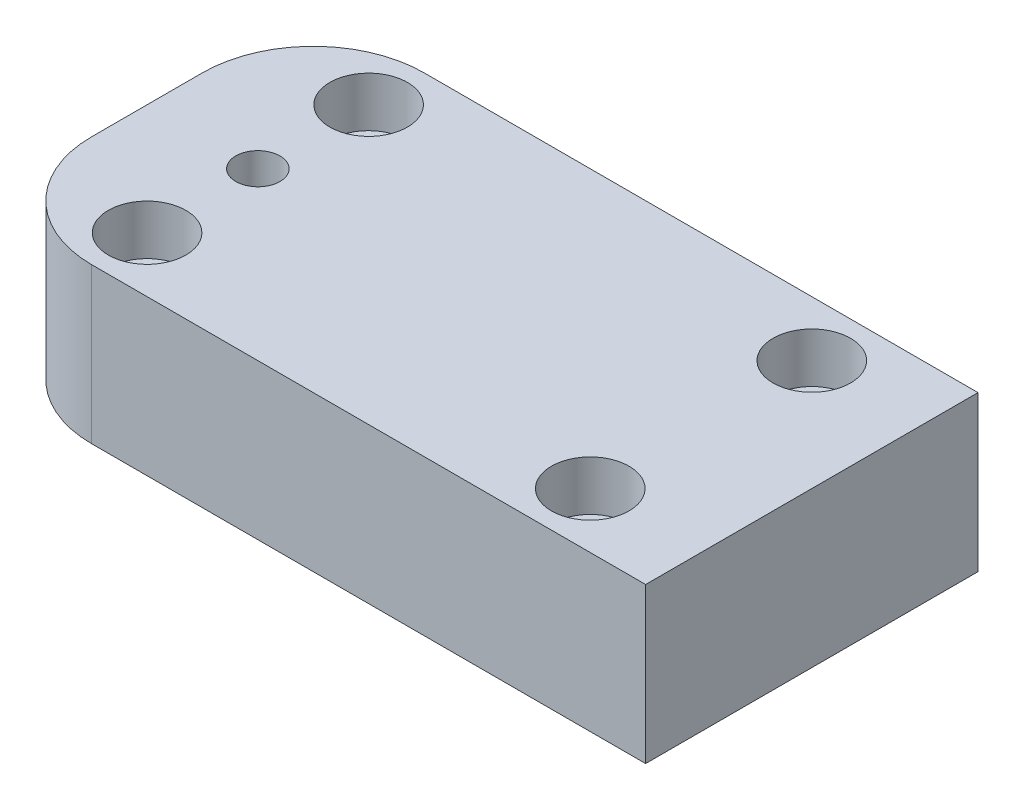
ISO-10303-21;
HEADER;
FILE_DESCRIPTION(('STEP AP214'),'2;1');
FILE_NAME('part.step','',(''),(''),'','','');
FILE_SCHEMA(('AUTOMOTIVE_DESIGN { 1 0 10303 214 1 1 1 1 }'));
ENDSEC;
DATA;
#1=APPLICATION_CONTEXT('core data for automotive mechanical design processes');
#2=APPLICATION_PROTOCOL_DEFINITION('international standard','automotive_design',2000,#1);
#3=PRODUCT_CONTEXT('',#1,'mechanical');
#4=PRODUCT('Part','Part','',(#3));
#5=PRODUCT_RELATED_PRODUCT_CATEGORY('part','',(#4));
#6=PRODUCT_DEFINITION_FORMATION('','',#4);
#7=PRODUCT_DEFINITION_CONTEXT('part definition',#1,'design');
#8=PRODUCT_DEFINITION('design','',#6,#7);
#9=PRODUCT_DEFINITION_SHAPE('','',#8);
#10=(LENGTH_UNIT() NAMED_UNIT(*) SI_UNIT(.MILLI.,.METRE.));
#11=(NAMED_UNIT(*) PLANE_ANGLE_UNIT() SI_UNIT($,.RADIAN.));
#12=(NAMED_UNIT(*) SI_UNIT($,.STERADIAN.) SOLID_ANGLE_UNIT());
#13=UNCERTAINTY_MEASURE_WITH_UNIT(LENGTH_MEASURE(1.E-05),#10,'distance_accuracy_value','');
#14=(GEOMETRIC_REPRESENTATION_CONTEXT(3) GLOBAL_UNCERTAINTY_ASSIGNED_CONTEXT((#13)) GLOBAL_UNIT_ASSIGNED_CONTEXT((#10,
#11,#12)) REPRESENTATION_CONTEXT('',''));
#15=CARTESIAN_POINT('',(0.,0.,0.));
#16=DIRECTION('',(0.,0.,1.));
#17=DIRECTION('',(1.,0.,0.));
#18=AXIS2_PLACEMENT_3D('',#15,#16,#17);
#19=CARTESIAN_POINT('',(20.,14.,10.));
#20=DIRECTION('',(0.,-1.,0.));
#21=DIRECTION('',(0.,0.,-1.));
#22=AXIS2_PLACEMENT_3D('',#19,#20,#21);
#23=CYLINDRICAL_SURFACE('',#22,1.75);
#24=CARTESIAN_POINT('',(20.,0.,10.));
#25=DIRECTION('',(0.,1.,0.));
#26=DIRECTION('',(0.,0.,1.));
#27=AXIS2_PLACEMENT_3D('',#24,#25,#26);
#28=CIRCLE('',#27,1.75);
#29=CARTESIAN_POINT('',(20.,0.,11.75));
#30=VERTEX_POINT('',#29);
#31=EDGE_CURVE('E141',#30,#30,#28,.T.);
#32=ORIENTED_EDGE('',*,*,#31,.F.);
#33=EDGE_LOOP('',(#32));
#34=FACE_BOUND('',#33,.T.);
#35=CARTESIAN_POINT('',(20.,9.5,10.));
#36=DIRECTION('',(0.,1.,0.));
#37=DIRECTION('',(0.,0.,1.));
#38=AXIS2_PLACEMENT_3D('',#35,#36,#37);
#39=CIRCLE('',#38,1.75);
#40=CARTESIAN_POINT('',(20.,9.5,11.75));
#41=VERTEX_POINT('',#40);
#42=EDGE_CURVE('E45',#41,#41,#39,.T.);
#43=ORIENTED_EDGE('',*,*,#42,.T.);
#44=EDGE_LOOP('',(#43));
#45=FACE_BOUND('',#44,.T.);
#46=ADVANCED_FACE('F41',(#34,#45),#23,.F.);
#47=CARTESIAN_POINT('',(20.,14.,-10.));
#48=DIRECTION('',(0.,-1.,0.));
#49=DIRECTION('',(0.,0.,-1.));
#50=AXIS2_PLACEMENT_3D('',#47,#48,#49);
#51=CYLINDRICAL_SURFACE('',#50,1.75);
#52=CARTESIAN_POINT('',(20.,0.,-10.));
#53=DIRECTION('',(0.,1.,0.));
#54=DIRECTION('',(0.,0.,1.));
#55=AXIS2_PLACEMENT_3D('',#52,#53,#54);
#56=CIRCLE('',#55,1.75);
#57=CARTESIAN_POINT('',(20.,0.,-8.25));
#58=VERTEX_POINT('',#57);
#59=EDGE_CURVE('E177',#58,#58,#56,.T.);
#60=ORIENTED_EDGE('',*,*,#59,.F.);
#61=EDGE_LOOP('',(#60));
#62=FACE_BOUND('',#61,.T.);
#63=CARTESIAN_POINT('',(20.,9.5,-10.));
#64=DIRECTION('',(0.,1.,0.));
#65=DIRECTION('',(0.,0.,1.));
#66=AXIS2_PLACEMENT_3D('',#63,#64,#65);
#67=CIRCLE('',#66,1.75);
#68=CARTESIAN_POINT('',(20.,9.5,-8.25));
#69=VERTEX_POINT('',#68);
#70=EDGE_CURVE('E147',#69,#69,#67,.T.);
#71=ORIENTED_EDGE('',*,*,#70,.T.);
#72=EDGE_LOOP('',(#71));
#73=FACE_BOUND('',#72,.T.);
#74=ADVANCED_FACE('F220',(#62,#73),#51,.F.);
#75=CARTESIAN_POINT('',(-20.,14.,10.));
#76=DIRECTION('',(0.,-1.,0.));
#77=DIRECTION('',(0.,0.,-1.));
#78=AXIS2_PLACEMENT_3D('',#75,#76,#77);
#79=CYLINDRICAL_SURFACE('',#78,1.75);
#80=CARTESIAN_POINT('',(-20.,0.,10.));
#81=DIRECTION('',(0.,1.,0.));
#82=DIRECTION('',(0.,0.,1.));
#83=AXIS2_PLACEMENT_3D('',#80,#81,#82);
#84=CIRCLE('',#83,1.75);
#85=CARTESIAN_POINT('',(-20.,0.,11.75));
#86=VERTEX_POINT('',#85);
#87=EDGE_CURVE('E174',#86,#86,#84,.T.);
#88=ORIENTED_EDGE('',*,*,#87,.F.);
#89=EDGE_LOOP('',(#88));
#90=FACE_BOUND('',#89,.T.);
#91=CARTESIAN_POINT('',(-20.,9.5,10.));
#92=DIRECTION('',(0.,1.,0.));
#93=DIRECTION('',(0.,0.,1.));
#94=AXIS2_PLACEMENT_3D('',#91,#92,#93);
#95=CIRCLE('',#94,1.75);
#96=CARTESIAN_POINT('',(-20.,9.5,11.75));
#97=VERTEX_POINT('',#96);
#98=EDGE_CURVE('E143',#97,#97,#95,.T.);
#99=ORIENTED_EDGE('',*,*,#98,.T.);
#100=EDGE_LOOP('',(#99));
#101=FACE_BOUND('',#100,.T.);
#102=ADVANCED_FACE('F226',(#90,#101),#79,.F.);
#103=CARTESIAN_POINT('',(-20.,14.,-10.));
#104=DIRECTION('',(0.,-1.,0.));
#105=DIRECTION('',(0.,0.,-1.));
#106=AXIS2_PLACEMENT_3D('',#103,#104,#105);
#107=CYLINDRICAL_SURFACE('',#106,1.75);
#108=CARTESIAN_POINT('',(-20.,0.,-10.));
#109=DIRECTION('',(0.,1.,0.));
#110=DIRECTION('',(0.,0.,1.));
#111=AXIS2_PLACEMENT_3D('',#108,#109,#110);
#112=CIRCLE('',#111,1.75);
#113=CARTESIAN_POINT('',(-20.,0.,-8.25));
#114=VERTEX_POINT('',#113);
#115=EDGE_CURVE('E180',#114,#114,#112,.T.);
#116=ORIENTED_EDGE('',*,*,#115,.F.);
#117=EDGE_LOOP('',(#116));
#118=FACE_BOUND('',#117,.T.);
#119=CARTESIAN_POINT('',(-20.,9.5,-10.));
#120=DIRECTION('',(0.,1.,0.));
#121=DIRECTION('',(0.,0.,1.));
#122=AXIS2_PLACEMENT_3D('',#119,#120,#121);
#123=CIRCLE('',#122,1.75);
#124=CARTESIAN_POINT('',(-20.,9.5,-8.25));
#125=VERTEX_POINT('',#124);
#126=EDGE_CURVE('E138',#125,#125,#123,.T.);
#127=ORIENTED_EDGE('',*,*,#126,.T.);
#128=EDGE_LOOP('',(#127));
#129=FACE_BOUND('',#128,.T.);
#130=ADVANCED_FACE('F235',(#118,#129),#107,.F.);
#131=CARTESIAN_POINT('',(0.,14.,0.));
#132=DIRECTION('',(0.,-1.,0.));
#133=DIRECTION('',(0.,0.,-1.));
#134=AXIS2_PLACEMENT_3D('',#131,#132,#133);
#135=PLANE('',#134);
#136=CARTESIAN_POINT('',(20.,14.,10.));
#137=DIRECTION('',(0.,1.,0.));
#138=DIRECTION('',(0.,0.,1.));
#139=AXIS2_PLACEMENT_3D('',#136,#137,#138);
#140=CIRCLE('',#139,3.5);
#141=CARTESIAN_POINT('',(20.,14.,13.5));
#142=VERTEX_POINT('',#141);
#143=EDGE_CURVE('E163',#142,#142,#140,.T.);
#144=ORIENTED_EDGE('',*,*,#143,.F.);
#145=EDGE_LOOP('',(#144));
#146=FACE_BOUND('',#145,.T.);
#147=CARTESIAN_POINT('',(20.,14.,-10.));
#148=DIRECTION('',(0.,1.,0.));
#149=DIRECTION('',(0.,0.,1.));
#150=AXIS2_PLACEMENT_3D('',#147,#148,#149);
#151=CIRCLE('',#150,3.5);
#152=CARTESIAN_POINT('',(20.,14.,-6.5));
#153=VERTEX_POINT('',#152);
#154=EDGE_CURVE('E156',#153,#153,#151,.T.);
#155=ORIENTED_EDGE('',*,*,#154,.F.);
#156=EDGE_LOOP('',(#155));
#157=FACE_BOUND('',#156,.T.);
#158=CARTESIAN_POINT('',(-20.,14.,10.));
#159=DIRECTION('',(0.,1.,0.));
#160=DIRECTION('',(0.,0.,1.));
#161=AXIS2_PLACEMENT_3D('',#158,#159,#160);
#162=CIRCLE('',#161,3.5);
#163=CARTESIAN_POINT('',(-20.,14.,13.5));
#164=VERTEX_POINT('',#163);
#165=EDGE_CURVE('E149',#164,#164,#162,.T.);
#166=ORIENTED_EDGE('',*,*,#165,.F.);
#167=EDGE_LOOP('',(#166));
#168=FACE_BOUND('',#167,.T.);
#169=CARTESIAN_POINT('',(-20.,14.,-10.));
#170=DIRECTION('',(0.,1.,0.));
#171=DIRECTION('',(0.,0.,1.));
#172=AXIS2_PLACEMENT_3D('',#169,#170,#171);
#173=CIRCLE('',#172,3.5);
#174=CARTESIAN_POINT('',(-20.,14.,-6.5));
#175=VERTEX_POINT('',#174);
#176=EDGE_CURVE('E145',#175,#175,#173,.T.);
#177=ORIENTED_EDGE('',*,*,#176,.F.);
#178=EDGE_LOOP('',(#177));
#179=FACE_BOUND('',#178,.T.);
#180=DIRECTION('',(0.,0.,1.));
#181=VECTOR('',#180,1.);
#182=CARTESIAN_POINT('',(-30.,14.,15.));
#183=LINE('',#182,#181);
#184=CARTESIAN_POINT('',(-30.,14.,-5.));
#185=VERTEX_POINT('',#184);
#186=CARTESIAN_POINT('',(-30.,14.,5.));
#187=VERTEX_POINT('',#186);
#188=EDGE_CURVE('E103',#185,#187,#183,.T.);
#189=ORIENTED_EDGE('',*,*,#188,.T.);
#190=CARTESIAN_POINT('',(-20.,14.,5.));
#191=DIRECTION('',(0.,-1.,0.));
#192=DIRECTION('',(0.,0.,-1.));
#193=AXIS2_PLACEMENT_3D('',#190,#191,#192);
#194=CIRCLE('',#193,10.);
#195=CARTESIAN_POINT('',(-20.,14.,15.));
#196=VERTEX_POINT('',#195);
#197=EDGE_CURVE('E50',#187,#196,#194,.F.);
#198=ORIENTED_EDGE('',*,*,#197,.T.);
#199=DIRECTION('',(1.,0.,0.));
#200=VECTOR('',#199,1.);
#201=CARTESIAN_POINT('',(-30.,14.,15.));
#202=LINE('',#201,#200);
#203=CARTESIAN_POINT('',(30.,14.,15.));
#204=VERTEX_POINT('',#203);
#205=EDGE_CURVE('E110',#196,#204,#202,.T.);
#206=ORIENTED_EDGE('',*,*,#205,.T.);
#207=DIRECTION('',(0.,0.,-1.));
#208=VECTOR('',#207,1.);
#209=CARTESIAN_POINT('',(30.,14.,15.));
#210=LINE('',#209,#208);
#211=CARTESIAN_POINT('',(30.,14.,-15.));
#212=VERTEX_POINT('',#211);
#213=EDGE_CURVE('E104',#204,#212,#210,.T.);
#214=ORIENTED_EDGE('',*,*,#213,.T.);
#215=DIRECTION('',(-1.,0.,0.));
#216=VECTOR('',#215,1.);
#217=CARTESIAN_POINT('',(-30.,14.,-15.));
#218=LINE('',#217,#216);
#219=CARTESIAN_POINT('',(-20.,14.,-15.));
#220=VERTEX_POINT('',#219);
#221=EDGE_CURVE('E95',#212,#220,#218,.T.);
#222=ORIENTED_EDGE('',*,*,#221,.T.);
#223=CARTESIAN_POINT('',(-20.,14.,-5.));
#224=DIRECTION('',(0.,-1.,0.));
#225=DIRECTION('',(0.,0.,-1.));
#226=AXIS2_PLACEMENT_3D('',#223,#224,#225);
#227=CIRCLE('',#226,10.);
#228=EDGE_CURVE('E135',#220,#185,#227,.F.);
#229=ORIENTED_EDGE('',*,*,#228,.T.);
#230=EDGE_LOOP('',(#189,#198,#206,#214,#222,#229));
#231=FACE_BOUND('',#230,.T.);
#232=CARTESIAN_POINT('',(-20.,14.,0.));
#233=DIRECTION('',(0.,1.,0.));
#234=DIRECTION('',(0.,0.,1.));
#235=AXIS2_PLACEMENT_3D('',#232,#233,#234);
#236=CIRCLE('',#235,2.);
#237=CARTESIAN_POINT('',(-20.,14.,2.));
#238=VERTEX_POINT('',#237);
#239=EDGE_CURVE('E184',#238,#238,#236,.T.);
#240=ORIENTED_EDGE('',*,*,#239,.F.);
#241=EDGE_LOOP('',(#240));
#242=FACE_BOUND('',#241,.T.);
#243=ADVANCED_FACE('F107',(#146,#157,#168,#179,#231,#242),#135,.F.);
#244=CARTESIAN_POINT('',(0.,0.,0.));
#245=DIRECTION('',(0.,-1.,0.));
#246=DIRECTION('',(0.,0.,-1.));
#247=AXIS2_PLACEMENT_3D('',#244,#245,#246);
#248=PLANE('',#247);
#249=ORIENTED_EDGE('',*,*,#87,.T.);
#250=EDGE_LOOP('',(#249));
#251=FACE_BOUND('',#250,.T.);
#252=ORIENTED_EDGE('',*,*,#115,.T.);
#253=EDGE_LOOP('',(#252));
#254=FACE_BOUND('',#253,.T.);
#255=DIRECTION('',(1.,0.,0.));
#256=VECTOR('',#255,1.);
#257=CARTESIAN_POINT('',(-30.,0.,15.));
#258=LINE('',#257,#256);
#259=CARTESIAN_POINT('',(-20.,0.,15.));
#260=VERTEX_POINT('',#259);
#261=CARTESIAN_POINT('',(30.,0.,15.));
#262=VERTEX_POINT('',#261);
#263=EDGE_CURVE('E114',#260,#262,#258,.T.);
#264=ORIENTED_EDGE('',*,*,#263,.F.);
#265=CARTESIAN_POINT('',(-20.,0.,5.));
#266=DIRECTION('',(0.,-1.,0.));
#267=DIRECTION('',(0.,0.,-1.));
#268=AXIS2_PLACEMENT_3D('',#265,#266,#267);
#269=CIRCLE('',#268,10.);
#270=CARTESIAN_POINT('',(-30.,0.,5.));
#271=VERTEX_POINT('',#270);
#272=EDGE_CURVE('E129',#260,#271,#269,.T.);
#273=ORIENTED_EDGE('',*,*,#272,.T.);
#274=DIRECTION('',(0.,0.,1.));
#275=VECTOR('',#274,1.);
#276=CARTESIAN_POINT('',(-30.,0.,15.));
#277=LINE('',#276,#275);
#278=CARTESIAN_POINT('',(-30.,0.,-5.));
#279=VERTEX_POINT('',#278);
#280=EDGE_CURVE('E194',#279,#271,#277,.T.);
#281=ORIENTED_EDGE('',*,*,#280,.F.);
#282=CARTESIAN_POINT('',(-20.,0.,-5.));
#283=DIRECTION('',(0.,-1.,0.));
#284=DIRECTION('',(0.,0.,-1.));
#285=AXIS2_PLACEMENT_3D('',#282,#283,#284);
#286=CIRCLE('',#285,10.);
#287=CARTESIAN_POINT('',(-20.,0.,-15.));
#288=VERTEX_POINT('',#287);
#289=EDGE_CURVE('E123',#279,#288,#286,.T.);
#290=ORIENTED_EDGE('',*,*,#289,.T.);
#291=DIRECTION('',(-1.,0.,0.));
#292=VECTOR('',#291,1.);
#293=CARTESIAN_POINT('',(-30.,0.,-15.));
#294=LINE('',#293,#292);
#295=CARTESIAN_POINT('',(30.,0.,-15.));
#296=VERTEX_POINT('',#295);
#297=EDGE_CURVE('E192',#296,#288,#294,.T.);
#298=ORIENTED_EDGE('',*,*,#297,.F.);
#299=DIRECTION('',(0.,0.,-1.));
#300=VECTOR('',#299,1.);
#301=CARTESIAN_POINT('',(30.,0.,15.));
#302=LINE('',#301,#300);
#303=EDGE_CURVE('E118',#262,#296,#302,.T.);
#304=ORIENTED_EDGE('',*,*,#303,.F.);
#305=EDGE_LOOP('',(#264,#273,#281,#290,#298,#304));
#306=FACE_BOUND('',#305,.T.);
#307=CARTESIAN_POINT('',(-20.,0.,0.));
#308=DIRECTION('',(0.,1.,0.));
#309=DIRECTION('',(0.,0.,1.));
#310=AXIS2_PLACEMENT_3D('',#307,#308,#309);
#311=CIRCLE('',#310,2.);
#312=CARTESIAN_POINT('',(-20.,0.,2.));
#313=VERTEX_POINT('',#312);
#314=EDGE_CURVE('E183',#313,#313,#311,.T.);
#315=ORIENTED_EDGE('',*,*,#314,.T.);
#316=EDGE_LOOP('',(#315));
#317=FACE_BOUND('',#316,.T.);
#318=ORIENTED_EDGE('',*,*,#59,.T.);
#319=EDGE_LOOP('',(#318));
#320=FACE_BOUND('',#319,.T.);
#321=ORIENTED_EDGE('',*,*,#31,.T.);
#322=EDGE_LOOP('',(#321));
#323=FACE_BOUND('',#322,.T.);
#324=ADVANCED_FACE('F200',(#251,#254,#306,#317,#320,#323),#248,.T.);
#325=CARTESIAN_POINT('',(30.,14.,15.));
#326=DIRECTION('',(-1.,0.,0.));
#327=DIRECTION('',(0.,0.,1.));
#328=AXIS2_PLACEMENT_3D('',#325,#326,#327);
#329=PLANE('',#328);
#330=ORIENTED_EDGE('',*,*,#303,.T.);
#331=DIRECTION('',(0.,-1.,0.));
#332=VECTOR('',#331,1.);
#333=CARTESIAN_POINT('',(30.,14.,-15.));
#334=LINE('',#333,#332);
#335=EDGE_CURVE('E99',#212,#296,#334,.T.);
#336=ORIENTED_EDGE('',*,*,#335,.F.);
#337=ORIENTED_EDGE('',*,*,#213,.F.);
#338=DIRECTION('',(0.,-1.,0.));
#339=VECTOR('',#338,1.);
#340=CARTESIAN_POINT('',(30.,14.,15.));
#341=LINE('',#340,#339);
#342=EDGE_CURVE('E120',#204,#262,#341,.T.);
#343=ORIENTED_EDGE('',*,*,#342,.T.);
#344=EDGE_LOOP('',(#330,#336,#337,#343));
#345=FACE_BOUND('',#344,.T.);
#346=ADVANCED_FACE('F116',(#345),#329,.F.);
#347=CARTESIAN_POINT('',(-30.,14.,-15.));
#348=DIRECTION('',(0.,0.,1.));
#349=DIRECTION('',(1.,0.,0.));
#350=AXIS2_PLACEMENT_3D('',#347,#348,#349);
#351=PLANE('',#350);
#352=ORIENTED_EDGE('',*,*,#297,.T.);
#353=DIRECTION('',(0.,-1.,0.));
#354=VECTOR('',#353,1.);
#355=CARTESIAN_POINT('',(-20.,14.,-15.));
#356=LINE('',#355,#354);
#357=EDGE_CURVE('E11',#288,#220,#356,.F.);
#358=ORIENTED_EDGE('',*,*,#357,.T.);
#359=ORIENTED_EDGE('',*,*,#221,.F.);
#360=ORIENTED_EDGE('',*,*,#335,.T.);
#361=EDGE_LOOP('',(#352,#358,#359,#360));
#362=FACE_BOUND('',#361,.T.);
#363=ADVANCED_FACE('F97',(#362),#351,.F.);
#364=CARTESIAN_POINT('',(-30.,14.,15.));
#365=DIRECTION('',(1.,0.,0.));
#366=DIRECTION('',(0.,0.,-1.));
#367=AXIS2_PLACEMENT_3D('',#364,#365,#366);
#368=PLANE('',#367);
#369=ORIENTED_EDGE('',*,*,#280,.T.);
#370=DIRECTION('',(0.,-1.,0.));
#371=VECTOR('',#370,1.);
#372=CARTESIAN_POINT('',(-30.,14.,5.));
#373=LINE('',#372,#371);
#374=EDGE_CURVE('E64',#271,#187,#373,.F.);
#375=ORIENTED_EDGE('',*,*,#374,.T.);
#376=ORIENTED_EDGE('',*,*,#188,.F.);
#377=DIRECTION('',(0.,-1.,0.));
#378=VECTOR('',#377,1.);
#379=CARTESIAN_POINT('',(-30.,14.,-5.));
#380=LINE('',#379,#378);
#381=EDGE_CURVE('E131',#185,#279,#380,.T.);
#382=ORIENTED_EDGE('',*,*,#381,.T.);
#383=EDGE_LOOP('',(#369,#375,#376,#382));
#384=FACE_BOUND('',#383,.T.);
#385=ADVANCED_FACE('F206',(#384),#368,.F.);
#386=CARTESIAN_POINT('',(-30.,14.,15.));
#387=DIRECTION('',(0.,0.,-1.));
#388=DIRECTION('',(-1.,0.,0.));
#389=AXIS2_PLACEMENT_3D('',#386,#387,#388);
#390=PLANE('',#389);
#391=ORIENTED_EDGE('',*,*,#205,.F.);
#392=DIRECTION('',(0.,-1.,0.));
#393=VECTOR('',#392,1.);
#394=CARTESIAN_POINT('',(-20.,14.,15.));
#395=LINE('',#394,#393);
#396=EDGE_CURVE('E119',#196,#260,#395,.T.);
#397=ORIENTED_EDGE('',*,*,#396,.T.);
#398=ORIENTED_EDGE('',*,*,#263,.T.);
#399=ORIENTED_EDGE('',*,*,#342,.F.);
#400=EDGE_LOOP('',(#391,#397,#398,#399));
#401=FACE_BOUND('',#400,.T.);
#402=ADVANCED_FACE('F197',(#401),#390,.F.);
#403=CARTESIAN_POINT('',(-20.,14.,0.));
#404=DIRECTION('',(0.,-1.,0.));
#405=DIRECTION('',(0.,0.,-1.));
#406=AXIS2_PLACEMENT_3D('',#403,#404,#405);
#407=CYLINDRICAL_SURFACE('',#406,2.);
#408=ORIENTED_EDGE('',*,*,#239,.T.);
#409=EDGE_LOOP('',(#408));
#410=FACE_BOUND('',#409,.T.);
#411=ORIENTED_EDGE('',*,*,#314,.F.);
#412=EDGE_LOOP('',(#411));
#413=FACE_BOUND('',#412,.T.);
#414=ADVANCED_FACE('F210',(#410,#413),#407,.F.);
#415=CARTESIAN_POINT('',(-20.,14.,5.));
#416=DIRECTION('',(0.,-1.,0.));
#417=DIRECTION('',(0.,0.,-1.));
#418=AXIS2_PLACEMENT_3D('',#415,#416,#417);
#419=CYLINDRICAL_SURFACE('',#418,10.);
#420=ORIENTED_EDGE('',*,*,#197,.F.);
#421=ORIENTED_EDGE('',*,*,#374,.F.);
#422=ORIENTED_EDGE('',*,*,#272,.F.);
#423=ORIENTED_EDGE('',*,*,#396,.F.);
#424=EDGE_LOOP('',(#420,#421,#422,#423));
#425=FACE_BOUND('',#424,.T.);
#426=ADVANCED_FACE('F208',(#425),#419,.T.);
#427=CARTESIAN_POINT('',(-20.,14.,-5.));
#428=DIRECTION('',(0.,-1.,0.));
#429=DIRECTION('',(0.,0.,-1.));
#430=AXIS2_PLACEMENT_3D('',#427,#428,#429);
#431=CYLINDRICAL_SURFACE('',#430,10.);
#432=ORIENTED_EDGE('',*,*,#228,.F.);
#433=ORIENTED_EDGE('',*,*,#357,.F.);
#434=ORIENTED_EDGE('',*,*,#289,.F.);
#435=ORIENTED_EDGE('',*,*,#381,.F.);
#436=EDGE_LOOP('',(#432,#433,#434,#435));
#437=FACE_BOUND('',#436,.T.);
#438=ADVANCED_FACE('F43',(#437),#431,.T.);
#439=CARTESIAN_POINT('',(-20.,9.5,-10.));
#440=DIRECTION('',(0.,1.,0.));
#441=DIRECTION('',(0.,0.,1.));
#442=AXIS2_PLACEMENT_3D('',#439,#440,#441);
#443=CYLINDRICAL_SURFACE('',#442,3.5);
#444=CARTESIAN_POINT('',(-20.,9.5,-10.));
#445=DIRECTION('',(0.,1.,0.));
#446=DIRECTION('',(0.,0.,1.));
#447=AXIS2_PLACEMENT_3D('',#444,#445,#446);
#448=CIRCLE('',#447,3.5);
#449=CARTESIAN_POINT('',(-20.,9.5,-6.5));
#450=VERTEX_POINT('',#449);
#451=EDGE_CURVE('E142',#450,#450,#448,.T.);
#452=ORIENTED_EDGE('',*,*,#451,.F.);
#453=EDGE_LOOP('',(#452));
#454=FACE_BOUND('',#453,.T.);
#455=ORIENTED_EDGE('',*,*,#176,.T.);
#456=EDGE_LOOP('',(#455));
#457=FACE_BOUND('',#456,.T.);
#458=ADVANCED_FACE('F215',(#454,#457),#443,.F.);
#459=CARTESIAN_POINT('',(-20.,9.5,-10.));
#460=DIRECTION('',(0.,1.,0.));
#461=DIRECTION('',(0.,0.,1.));
#462=AXIS2_PLACEMENT_3D('',#459,#460,#461);
#463=PLANE('',#462);
#464=ORIENTED_EDGE('',*,*,#126,.F.);
#465=EDGE_LOOP('',(#464));
#466=FACE_BOUND('',#465,.T.);
#467=ORIENTED_EDGE('',*,*,#451,.T.);
#468=EDGE_LOOP('',(#467));
#469=FACE_BOUND('',#468,.T.);
#470=ADVANCED_FACE('F307',(#466,#469),#463,.T.);
#471=CARTESIAN_POINT('',(-20.,9.5,10.));
#472=DIRECTION('',(0.,1.,0.));
#473=DIRECTION('',(0.,0.,1.));
#474=AXIS2_PLACEMENT_3D('',#471,#472,#473);
#475=CYLINDRICAL_SURFACE('',#474,3.5);
#476=CARTESIAN_POINT('',(-20.,9.5,10.));
#477=DIRECTION('',(0.,1.,0.));
#478=DIRECTION('',(0.,0.,1.));
#479=AXIS2_PLACEMENT_3D('',#476,#477,#478);
#480=CIRCLE('',#479,3.5);
#481=CARTESIAN_POINT('',(-20.,9.5,13.5));
#482=VERTEX_POINT('',#481);
#483=EDGE_CURVE('E146',#482,#482,#480,.T.);
#484=ORIENTED_EDGE('',*,*,#483,.F.);
#485=EDGE_LOOP('',(#484));
#486=FACE_BOUND('',#485,.T.);
#487=ORIENTED_EDGE('',*,*,#165,.T.);
#488=EDGE_LOOP('',(#487));
#489=FACE_BOUND('',#488,.T.);
#490=ADVANCED_FACE('F317',(#486,#489),#475,.F.);
#491=CARTESIAN_POINT('',(-20.,9.5,10.));
#492=DIRECTION('',(0.,1.,0.));
#493=DIRECTION('',(0.,0.,1.));
#494=AXIS2_PLACEMENT_3D('',#491,#492,#493);
#495=PLANE('',#494);
#496=ORIENTED_EDGE('',*,*,#98,.F.);
#497=EDGE_LOOP('',(#496));
#498=FACE_BOUND('',#497,.T.);
#499=ORIENTED_EDGE('',*,*,#483,.T.);
#500=EDGE_LOOP('',(#499));
#501=FACE_BOUND('',#500,.T.);
#502=ADVANCED_FACE('F326',(#498,#501),#495,.T.);
#503=CARTESIAN_POINT('',(20.,9.5,-10.));
#504=DIRECTION('',(0.,1.,0.));
#505=DIRECTION('',(0.,0.,1.));
#506=AXIS2_PLACEMENT_3D('',#503,#504,#505);
#507=CYLINDRICAL_SURFACE('',#506,3.5);
#508=CARTESIAN_POINT('',(20.,9.5,-10.));
#509=DIRECTION('',(0.,1.,0.));
#510=DIRECTION('',(0.,0.,1.));
#511=AXIS2_PLACEMENT_3D('',#508,#509,#510);
#512=CIRCLE('',#511,3.5);
#513=CARTESIAN_POINT('',(20.,9.5,-6.5));
#514=VERTEX_POINT('',#513);
#515=EDGE_CURVE('E150',#514,#514,#512,.T.);
#516=ORIENTED_EDGE('',*,*,#515,.F.);
#517=EDGE_LOOP('',(#516));
#518=FACE_BOUND('',#517,.T.);
#519=ORIENTED_EDGE('',*,*,#154,.T.);
#520=EDGE_LOOP('',(#519));
#521=FACE_BOUND('',#520,.T.);
#522=ADVANCED_FACE('F336',(#518,#521),#507,.F.);
#523=CARTESIAN_POINT('',(20.,9.5,-10.));
#524=DIRECTION('',(0.,1.,0.));
#525=DIRECTION('',(0.,0.,1.));
#526=AXIS2_PLACEMENT_3D('',#523,#524,#525);
#527=PLANE('',#526);
#528=ORIENTED_EDGE('',*,*,#70,.F.);
#529=EDGE_LOOP('',(#528));
#530=FACE_BOUND('',#529,.T.);
#531=ORIENTED_EDGE('',*,*,#515,.T.);
#532=EDGE_LOOP('',(#531));
#533=FACE_BOUND('',#532,.T.);
#534=ADVANCED_FACE('F346',(#530,#533),#527,.T.);
#535=CARTESIAN_POINT('',(20.,9.5,10.));
#536=DIRECTION('',(0.,1.,0.));
#537=DIRECTION('',(0.,0.,1.));
#538=AXIS2_PLACEMENT_3D('',#535,#536,#537);
#539=CYLINDRICAL_SURFACE('',#538,3.5);
#540=CARTESIAN_POINT('',(20.,9.5,10.));
#541=DIRECTION('',(0.,1.,0.));
#542=DIRECTION('',(0.,0.,1.));
#543=AXIS2_PLACEMENT_3D('',#540,#541,#542);
#544=CIRCLE('',#543,3.5);
#545=CARTESIAN_POINT('',(20.,9.5,13.5));
#546=VERTEX_POINT('',#545);
#547=EDGE_CURVE('E385',#546,#546,#544,.T.);
#548=ORIENTED_EDGE('',*,*,#547,.F.);
#549=EDGE_LOOP('',(#548));
#550=FACE_BOUND('',#549,.T.);
#551=ORIENTED_EDGE('',*,*,#143,.T.);
#552=EDGE_LOOP('',(#551));
#553=FACE_BOUND('',#552,.T.);
#554=ADVANCED_FACE('F356',(#550,#553),#539,.F.);
#555=CARTESIAN_POINT('',(20.,9.5,10.));
#556=DIRECTION('',(0.,1.,0.));
#557=DIRECTION('',(0.,0.,1.));
#558=AXIS2_PLACEMENT_3D('',#555,#556,#557);
#559=PLANE('',#558);
#560=ORIENTED_EDGE('',*,*,#42,.F.);
#561=EDGE_LOOP('',(#560));
#562=FACE_BOUND('',#561,.T.);
#563=ORIENTED_EDGE('',*,*,#547,.T.);
#564=EDGE_LOOP('',(#563));
#565=FACE_BOUND('',#564,.T.);
#566=ADVANCED_FACE('F366',(#562,#565),#559,.T.);
#567=CLOSED_SHELL('',(#46,#74,#102,#130,#243,#324,#346,#363,#385,#402,#414,#426,#438,#458,#470,
#490,#502,#522,#534,#554,#566));
#568=MANIFOLD_SOLID_BREP('B2',#567);
#569=ADVANCED_BREP_SHAPE_REPRESENTATION('',(#18,#568),#14);
#570=SHAPE_DEFINITION_REPRESENTATION(#9,#569);
ENDSEC;
END-ISO-10303-21;
